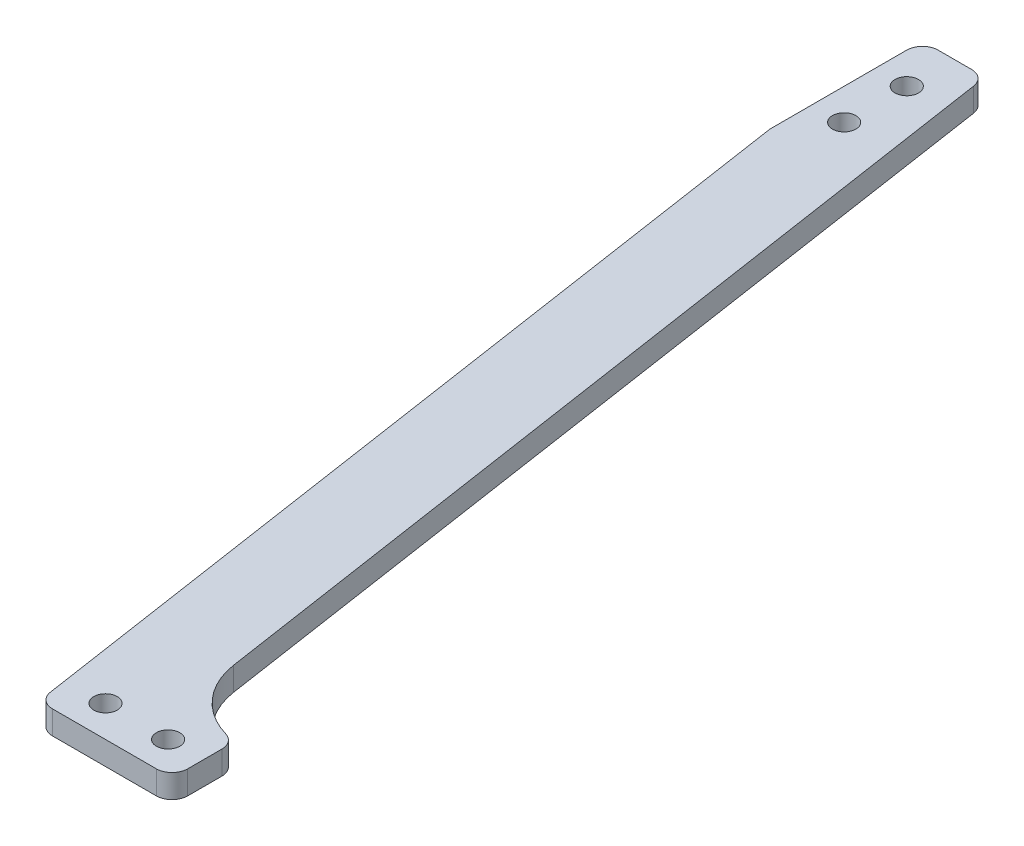
ISO-10303-21;
HEADER;
FILE_DESCRIPTION(('STEP AP214'),'2;1');
FILE_NAME('part.step','',(''),(''),'','','');
FILE_SCHEMA(('AUTOMOTIVE_DESIGN { 1 0 10303 214 1 1 1 1 }'));
ENDSEC;
DATA;
#1=APPLICATION_CONTEXT('core data for automotive mechanical design processes');
#2=APPLICATION_PROTOCOL_DEFINITION('international standard','automotive_design',2000,#1);
#3=PRODUCT_CONTEXT('',#1,'mechanical');
#4=PRODUCT('Part','Part','',(#3));
#5=PRODUCT_RELATED_PRODUCT_CATEGORY('part','',(#4));
#6=PRODUCT_DEFINITION_FORMATION('','',#4);
#7=PRODUCT_DEFINITION_CONTEXT('part definition',#1,'design');
#8=PRODUCT_DEFINITION('design','',#6,#7);
#9=PRODUCT_DEFINITION_SHAPE('','',#8);
#10=(LENGTH_UNIT() NAMED_UNIT(*) SI_UNIT(.MILLI.,.METRE.));
#11=(NAMED_UNIT(*) PLANE_ANGLE_UNIT() SI_UNIT($,.RADIAN.));
#12=(NAMED_UNIT(*) SI_UNIT($,.STERADIAN.) SOLID_ANGLE_UNIT());
#13=UNCERTAINTY_MEASURE_WITH_UNIT(LENGTH_MEASURE(1.E-05),#10,'distance_accuracy_value','');
#14=(GEOMETRIC_REPRESENTATION_CONTEXT(3) GLOBAL_UNCERTAINTY_ASSIGNED_CONTEXT((#13)) GLOBAL_UNIT_ASSIGNED_CONTEXT((#10,
#11,#12)) REPRESENTATION_CONTEXT('',''));
#15=CARTESIAN_POINT('',(0.,0.,0.));
#16=DIRECTION('',(0.,0.,1.));
#17=DIRECTION('',(1.,0.,0.));
#18=AXIS2_PLACEMENT_3D('',#15,#16,#17);
#19=CARTESIAN_POINT('',(0.,3.,0.));
#20=DIRECTION('',(0.,-1.,0.));
#21=DIRECTION('',(0.,0.,-1.));
#22=AXIS2_PLACEMENT_3D('',#19,#20,#21);
#23=PLANE('',#22);
#24=DIRECTION('',(0.,0.,-1.));
#25=VECTOR('',#24,1.);
#26=CARTESIAN_POINT('',(33.6,3.,-8.));
#27=LINE('',#26,#25);
#28=CARTESIAN_POINT('',(33.6,3.,-2.));
#29=VERTEX_POINT('',#28);
#30=CARTESIAN_POINT('',(33.6,3.,-6.38608106159937));
#31=VERTEX_POINT('',#30);
#32=EDGE_CURVE('E160',#29,#31,#27,.T.);
#33=ORIENTED_EDGE('',*,*,#32,.T.);
#34=CARTESIAN_POINT('',(31.6,3.,-6.38608106159937));
#35=DIRECTION('',(0.,-1.,0.));
#36=DIRECTION('',(0.,0.,-1.));
#37=AXIS2_PLACEMENT_3D('',#34,#35,#36);
#38=CIRCLE('',#37,2.);
#39=CARTESIAN_POINT('',(32.1589127990271,3.,-8.30639782793864));
#40=VERTEX_POINT('',#39);
#41=EDGE_CURVE('E11',#31,#40,#38,.F.);
#42=ORIENTED_EDGE('',*,*,#41,.T.);
#43=CARTESIAN_POINT('',(34.9534767941624,3.,-17.907981659635));
#44=DIRECTION('',(0.,-1.,0.));
#45=DIRECTION('',(0.,0.,-1.));
#46=AXIS2_PLACEMENT_3D('',#43,#44,#45);
#47=CIRCLE('',#46,10.);
#48=CARTESIAN_POINT('',(25.0654358715812,3.,-16.4157863931364));
#49=VERTEX_POINT('',#48);
#50=EDGE_CURVE('E190',#40,#49,#47,.T.);
#51=ORIENTED_EDGE('',*,*,#50,.T.);
#52=DIRECTION('',(-0.149219526649861,0.,-0.988804092258113));
#53=VECTOR('',#52,1.);
#54=CARTESIAN_POINT('',(8.,3.,-129.5));
#55=LINE('',#54,#53);
#56=CARTESIAN_POINT('',(8.25678101559295,3.,-127.7984390533));
#57=VERTEX_POINT('',#56);
#58=EDGE_CURVE('E169',#49,#57,#55,.T.);
#59=ORIENTED_EDGE('',*,*,#58,.T.);
#60=CARTESIAN_POINT('',(6.27917283107673,3.,-127.5));
#61=DIRECTION('',(0.,-1.,0.));
#62=DIRECTION('',(0.,0.,-1.));
#63=AXIS2_PLACEMENT_3D('',#60,#61,#62);
#64=CIRCLE('',#63,2.);
#65=CARTESIAN_POINT('',(6.27917283107673,3.,-129.5));
#66=VERTEX_POINT('',#65);
#67=EDGE_CURVE('E212',#57,#66,#64,.F.);
#68=ORIENTED_EDGE('',*,*,#67,.T.);
#69=DIRECTION('',(-1.,0.,0.));
#70=VECTOR('',#69,1.);
#71=CARTESIAN_POINT('',(0.,3.,-129.5));
#72=LINE('',#71,#70);
#73=CARTESIAN_POINT('',(2.,3.,-129.5));
#74=VERTEX_POINT('',#73);
#75=EDGE_CURVE('E143',#66,#74,#72,.T.);
#76=ORIENTED_EDGE('',*,*,#75,.T.);
#77=CARTESIAN_POINT('',(2.,3.,-127.5));
#78=DIRECTION('',(0.,-1.,0.));
#79=DIRECTION('',(0.,0.,-1.));
#80=AXIS2_PLACEMENT_3D('',#77,#78,#79);
#81=CIRCLE('',#80,2.);
#82=CARTESIAN_POINT('',(0.,3.,-127.5));
#83=VERTEX_POINT('',#82);
#84=EDGE_CURVE('E138',#74,#83,#81,.F.);
#85=ORIENTED_EDGE('',*,*,#84,.T.);
#86=DIRECTION('',(0.,0.,1.));
#87=VECTOR('',#86,1.);
#88=CARTESIAN_POINT('',(0.,3.,-110.));
#89=LINE('',#88,#87);
#90=CARTESIAN_POINT('',(0.,3.,-110.));
#91=VERTEX_POINT('',#90);
#92=EDGE_CURVE('E130',#83,#91,#89,.T.);
#93=ORIENTED_EDGE('',*,*,#92,.T.);
#94=DIRECTION('',(0.149219526649861,0.,0.988804092258113));
#95=VECTOR('',#94,1.);
#96=CARTESIAN_POINT('',(16.6,3.,0.));
#97=LINE('',#96,#95);
#98=CARTESIAN_POINT('',(16.343218984407,3.,-1.70156094670028));
#99=VERTEX_POINT('',#98);
#100=EDGE_CURVE('E134',#91,#99,#97,.T.);
#101=ORIENTED_EDGE('',*,*,#100,.T.);
#102=CARTESIAN_POINT('',(18.3208271689233,3.,-2.));
#103=DIRECTION('',(0.,-1.,0.));
#104=DIRECTION('',(0.,0.,-1.));
#105=AXIS2_PLACEMENT_3D('',#102,#103,#104);
#106=CIRCLE('',#105,2.);
#107=CARTESIAN_POINT('',(18.3208271689233,3.,0.));
#108=VERTEX_POINT('',#107);
#109=EDGE_CURVE('E209',#99,#108,#106,.F.);
#110=ORIENTED_EDGE('',*,*,#109,.T.);
#111=DIRECTION('',(1.,0.,0.));
#112=VECTOR('',#111,1.);
#113=CARTESIAN_POINT('',(33.6,3.,0.));
#114=LINE('',#113,#112);
#115=CARTESIAN_POINT('',(31.6,3.,0.));
#116=VERTEX_POINT('',#115);
#117=EDGE_CURVE('E157',#108,#116,#114,.T.);
#118=ORIENTED_EDGE('',*,*,#117,.T.);
#119=CARTESIAN_POINT('',(31.6,3.,-2.));
#120=DIRECTION('',(0.,-1.,0.));
#121=DIRECTION('',(0.,0.,-1.));
#122=AXIS2_PLACEMENT_3D('',#119,#120,#121);
#123=CIRCLE('',#122,2.);
#124=EDGE_CURVE('E207',#116,#29,#123,.F.);
#125=ORIENTED_EDGE('',*,*,#124,.T.);
#126=EDGE_LOOP('',(#33,#42,#51,#59,#68,#76,#85,#93,#101,#110,#118,#125));
#127=FACE_BOUND('',#126,.T.);
#128=CARTESIAN_POINT('',(29.1,3.,-4.00000000000001));
#129=DIRECTION('',(0.,1.,0.));
#130=DIRECTION('',(0.,0.,1.));
#131=AXIS2_PLACEMENT_3D('',#128,#129,#130);
#132=CIRCLE('',#131,1.5);
#133=CARTESIAN_POINT('',(29.1,3.,-2.50000000000001));
#134=VERTEX_POINT('',#133);
#135=EDGE_CURVE('E176',#134,#134,#132,.T.);
#136=ORIENTED_EDGE('',*,*,#135,.F.);
#137=EDGE_LOOP('',(#136));
#138=FACE_BOUND('',#137,.T.);
#139=CARTESIAN_POINT('',(21.1,3.,-4.));
#140=DIRECTION('',(0.,1.,0.));
#141=DIRECTION('',(0.,0.,1.));
#142=AXIS2_PLACEMENT_3D('',#139,#140,#141);
#143=CIRCLE('',#142,1.5);
#144=CARTESIAN_POINT('',(21.1,3.,-2.5));
#145=VERTEX_POINT('',#144);
#146=EDGE_CURVE('E423',#145,#145,#143,.T.);
#147=ORIENTED_EDGE('',*,*,#146,.F.);
#148=EDGE_LOOP('',(#147));
#149=FACE_BOUND('',#148,.T.);
#150=CARTESIAN_POINT('',(4.,3.,-115.5));
#151=DIRECTION('',(0.,1.,0.));
#152=DIRECTION('',(0.,0.,1.));
#153=AXIS2_PLACEMENT_3D('',#150,#151,#152);
#154=CIRCLE('',#153,1.5);
#155=CARTESIAN_POINT('',(4.,3.,-114.));
#156=VERTEX_POINT('',#155);
#157=EDGE_CURVE('E429',#156,#156,#154,.T.);
#158=ORIENTED_EDGE('',*,*,#157,.F.);
#159=EDGE_LOOP('',(#158));
#160=FACE_BOUND('',#159,.T.);
#161=CARTESIAN_POINT('',(4.,3.,-123.5));
#162=DIRECTION('',(0.,1.,0.));
#163=DIRECTION('',(0.,0.,1.));
#164=AXIS2_PLACEMENT_3D('',#161,#162,#163);
#165=CIRCLE('',#164,1.5);
#166=CARTESIAN_POINT('',(4.,3.,-122.));
#167=VERTEX_POINT('',#166);
#168=EDGE_CURVE('E435',#167,#167,#165,.T.);
#169=ORIENTED_EDGE('',*,*,#168,.F.);
#170=EDGE_LOOP('',(#169));
#171=FACE_BOUND('',#170,.T.);
#172=ADVANCED_FACE('F41',(#127,#138,#149,#160,#171),#23,.F.);
#173=CARTESIAN_POINT('',(0.,0.,0.));
#174=DIRECTION('',(0.,-1.,0.));
#175=DIRECTION('',(0.,0.,-1.));
#176=AXIS2_PLACEMENT_3D('',#173,#174,#175);
#177=PLANE('',#176);
#178=CARTESIAN_POINT('',(4.,0.,-115.5));
#179=DIRECTION('',(0.,1.,0.));
#180=DIRECTION('',(0.,0.,1.));
#181=AXIS2_PLACEMENT_3D('',#178,#179,#180);
#182=CIRCLE('',#181,1.5);
#183=CARTESIAN_POINT('',(4.,0.,-114.));
#184=VERTEX_POINT('',#183);
#185=EDGE_CURVE('E432',#184,#184,#182,.T.);
#186=ORIENTED_EDGE('',*,*,#185,.T.);
#187=EDGE_LOOP('',(#186));
#188=FACE_BOUND('',#187,.T.);
#189=CARTESIAN_POINT('',(29.1,0.,-4.00000000000001));
#190=DIRECTION('',(0.,1.,0.));
#191=DIRECTION('',(0.,0.,1.));
#192=AXIS2_PLACEMENT_3D('',#189,#190,#191);
#193=CIRCLE('',#192,1.5);
#194=CARTESIAN_POINT('',(29.1,0.,-2.50000000000001));
#195=VERTEX_POINT('',#194);
#196=EDGE_CURVE('E165',#195,#195,#193,.T.);
#197=ORIENTED_EDGE('',*,*,#196,.T.);
#198=EDGE_LOOP('',(#197));
#199=FACE_BOUND('',#198,.T.);
#200=CARTESIAN_POINT('',(34.9534767941624,0.,-17.907981659635));
#201=DIRECTION('',(0.,-1.,0.));
#202=DIRECTION('',(0.,0.,-1.));
#203=AXIS2_PLACEMENT_3D('',#200,#201,#202);
#204=CIRCLE('',#203,10.);
#205=CARTESIAN_POINT('',(25.0654358715812,0.,-16.4157863931364));
#206=VERTEX_POINT('',#205);
#207=CARTESIAN_POINT('',(32.1589127990271,0.,-8.30639782793864));
#208=VERTEX_POINT('',#207);
#209=EDGE_CURVE('E188',#206,#208,#204,.F.);
#210=ORIENTED_EDGE('',*,*,#209,.T.);
#211=CARTESIAN_POINT('',(31.6,0.,-6.38608106159937));
#212=DIRECTION('',(0.,-1.,0.));
#213=DIRECTION('',(0.,0.,-1.));
#214=AXIS2_PLACEMENT_3D('',#211,#212,#213);
#215=CIRCLE('',#214,2.);
#216=CARTESIAN_POINT('',(33.6,0.,-6.38608106159937));
#217=VERTEX_POINT('',#216);
#218=EDGE_CURVE('E63',#208,#217,#215,.T.);
#219=ORIENTED_EDGE('',*,*,#218,.T.);
#220=DIRECTION('',(0.,0.,-1.));
#221=VECTOR('',#220,1.);
#222=CARTESIAN_POINT('',(33.6,0.,-8.));
#223=LINE('',#222,#221);
#224=CARTESIAN_POINT('',(33.6,0.,-2.));
#225=VERTEX_POINT('',#224);
#226=EDGE_CURVE('E179',#225,#217,#223,.T.);
#227=ORIENTED_EDGE('',*,*,#226,.F.);
#228=CARTESIAN_POINT('',(31.6,0.,-2.));
#229=DIRECTION('',(0.,-1.,0.));
#230=DIRECTION('',(0.,0.,-1.));
#231=AXIS2_PLACEMENT_3D('',#228,#229,#230);
#232=CIRCLE('',#231,2.);
#233=CARTESIAN_POINT('',(31.6,0.,0.));
#234=VERTEX_POINT('',#233);
#235=EDGE_CURVE('E197',#225,#234,#232,.T.);
#236=ORIENTED_EDGE('',*,*,#235,.T.);
#237=DIRECTION('',(1.,0.,0.));
#238=VECTOR('',#237,1.);
#239=CARTESIAN_POINT('',(33.6,0.,0.));
#240=LINE('',#239,#238);
#241=CARTESIAN_POINT('',(18.3208271689233,0.,0.));
#242=VERTEX_POINT('',#241);
#243=EDGE_CURVE('E175',#242,#234,#240,.T.);
#244=ORIENTED_EDGE('',*,*,#243,.F.);
#245=CARTESIAN_POINT('',(18.3208271689233,0.,-2.));
#246=DIRECTION('',(0.,-1.,0.));
#247=DIRECTION('',(0.,0.,-1.));
#248=AXIS2_PLACEMENT_3D('',#245,#246,#247);
#249=CIRCLE('',#248,2.);
#250=CARTESIAN_POINT('',(16.343218984407,0.,-1.70156094670028));
#251=VERTEX_POINT('',#250);
#252=EDGE_CURVE('E199',#242,#251,#249,.T.);
#253=ORIENTED_EDGE('',*,*,#252,.T.);
#254=DIRECTION('',(0.149219526649861,0.,0.988804092258113));
#255=VECTOR('',#254,1.);
#256=CARTESIAN_POINT('',(16.6,0.,0.));
#257=LINE('',#256,#255);
#258=CARTESIAN_POINT('',(0.,0.,-110.));
#259=VERTEX_POINT('',#258);
#260=EDGE_CURVE('E173',#259,#251,#257,.T.);
#261=ORIENTED_EDGE('',*,*,#260,.F.);
#262=DIRECTION('',(0.,0.,1.));
#263=VECTOR('',#262,1.);
#264=CARTESIAN_POINT('',(0.,0.,-110.));
#265=LINE('',#264,#263);
#266=CARTESIAN_POINT('',(0.,0.,-127.5));
#267=VERTEX_POINT('',#266);
#268=EDGE_CURVE('E148',#267,#259,#265,.T.);
#269=ORIENTED_EDGE('',*,*,#268,.F.);
#270=CARTESIAN_POINT('',(2.,0.,-127.5));
#271=DIRECTION('',(0.,-1.,0.));
#272=DIRECTION('',(0.,0.,-1.));
#273=AXIS2_PLACEMENT_3D('',#270,#271,#272);
#274=CIRCLE('',#273,2.);
#275=CARTESIAN_POINT('',(2.,0.,-129.5));
#276=VERTEX_POINT('',#275);
#277=EDGE_CURVE('E201',#267,#276,#274,.T.);
#278=ORIENTED_EDGE('',*,*,#277,.T.);
#279=DIRECTION('',(-1.,0.,0.));
#280=VECTOR('',#279,1.);
#281=CARTESIAN_POINT('',(0.,0.,-129.5));
#282=LINE('',#281,#280);
#283=CARTESIAN_POINT('',(6.27917283107673,0.,-129.5));
#284=VERTEX_POINT('',#283);
#285=EDGE_CURVE('E162',#284,#276,#282,.T.);
#286=ORIENTED_EDGE('',*,*,#285,.F.);
#287=CARTESIAN_POINT('',(6.27917283107673,0.,-127.5));
#288=DIRECTION('',(0.,-1.,0.));
#289=DIRECTION('',(0.,0.,-1.));
#290=AXIS2_PLACEMENT_3D('',#287,#288,#289);
#291=CIRCLE('',#290,2.);
#292=CARTESIAN_POINT('',(8.25678101559295,0.,-127.7984390533));
#293=VERTEX_POINT('',#292);
#294=EDGE_CURVE('E203',#284,#293,#291,.T.);
#295=ORIENTED_EDGE('',*,*,#294,.T.);
#296=DIRECTION('',(-0.149219526649861,0.,-0.988804092258113));
#297=VECTOR('',#296,1.);
#298=CARTESIAN_POINT('',(8.,0.,-129.5));
#299=LINE('',#298,#297);
#300=EDGE_CURVE('E181',#206,#293,#299,.T.);
#301=ORIENTED_EDGE('',*,*,#300,.F.);
#302=EDGE_LOOP('',(#210,#219,#227,#236,#244,#253,#261,#269,#278,#286,#295,#301));
#303=FACE_BOUND('',#302,.T.);
#304=CARTESIAN_POINT('',(21.1,0.,-4.));
#305=DIRECTION('',(0.,1.,0.));
#306=DIRECTION('',(0.,0.,1.));
#307=AXIS2_PLACEMENT_3D('',#304,#305,#306);
#308=CIRCLE('',#307,1.5);
#309=CARTESIAN_POINT('',(21.1,0.,-2.5));
#310=VERTEX_POINT('',#309);
#311=EDGE_CURVE('E425',#310,#310,#308,.T.);
#312=ORIENTED_EDGE('',*,*,#311,.T.);
#313=EDGE_LOOP('',(#312));
#314=FACE_BOUND('',#313,.T.);
#315=CARTESIAN_POINT('',(4.,0.,-123.5));
#316=DIRECTION('',(0.,1.,0.));
#317=DIRECTION('',(0.,0.,1.));
#318=AXIS2_PLACEMENT_3D('',#315,#316,#317);
#319=CIRCLE('',#318,1.5);
#320=CARTESIAN_POINT('',(4.,0.,-122.));
#321=VERTEX_POINT('',#320);
#322=EDGE_CURVE('E438',#321,#321,#319,.T.);
#323=ORIENTED_EDGE('',*,*,#322,.T.);
#324=EDGE_LOOP('',(#323));
#325=FACE_BOUND('',#324,.T.);
#326=ADVANCED_FACE('F236',(#188,#199,#303,#314,#325),#177,.T.);
#327=CARTESIAN_POINT('',(16.6,3.,0.));
#328=DIRECTION('',(0.988804092258113,0.,-0.149219526649861));
#329=DIRECTION('',(-0.149219526649861,0.,-0.988804092258113));
#330=AXIS2_PLACEMENT_3D('',#327,#328,#329);
#331=PLANE('',#330);
#332=ORIENTED_EDGE('',*,*,#260,.T.);
#333=DIRECTION('',(0.,-1.,0.));
#334=VECTOR('',#333,1.);
#335=CARTESIAN_POINT('',(16.343218984407,3.,-1.70156094670028));
#336=LINE('',#335,#334);
#337=EDGE_CURVE('E156',#251,#99,#336,.F.);
#338=ORIENTED_EDGE('',*,*,#337,.T.);
#339=ORIENTED_EDGE('',*,*,#100,.F.);
#340=DIRECTION('',(0.,-1.,0.));
#341=VECTOR('',#340,1.);
#342=CARTESIAN_POINT('',(0.,3.,-110.));
#343=LINE('',#342,#341);
#344=EDGE_CURVE('E142',#91,#259,#343,.T.);
#345=ORIENTED_EDGE('',*,*,#344,.T.);
#346=EDGE_LOOP('',(#332,#338,#339,#345));
#347=FACE_BOUND('',#346,.T.);
#348=ADVANCED_FACE('F154',(#347),#331,.F.);
#349=CARTESIAN_POINT('',(33.6,3.,0.));
#350=DIRECTION('',(0.,0.,-1.));
#351=DIRECTION('',(-1.,0.,0.));
#352=AXIS2_PLACEMENT_3D('',#349,#350,#351);
#353=PLANE('',#352);
#354=ORIENTED_EDGE('',*,*,#117,.F.);
#355=DIRECTION('',(0.,-1.,0.));
#356=VECTOR('',#355,1.);
#357=CARTESIAN_POINT('',(18.3208271689233,3.,0.));
#358=LINE('',#357,#356);
#359=EDGE_CURVE('E218',#108,#242,#358,.T.);
#360=ORIENTED_EDGE('',*,*,#359,.T.);
#361=ORIENTED_EDGE('',*,*,#243,.T.);
#362=DIRECTION('',(0.,-1.,0.));
#363=VECTOR('',#362,1.);
#364=CARTESIAN_POINT('',(31.6,3.,0.));
#365=LINE('',#364,#363);
#366=EDGE_CURVE('E216',#234,#116,#365,.F.);
#367=ORIENTED_EDGE('',*,*,#366,.T.);
#368=EDGE_LOOP('',(#354,#360,#361,#367));
#369=FACE_BOUND('',#368,.T.);
#370=ADVANCED_FACE('F260',(#369),#353,.F.);
#371=CARTESIAN_POINT('',(33.6,3.,-8.));
#372=DIRECTION('',(-1.,0.,0.));
#373=DIRECTION('',(0.,0.,1.));
#374=AXIS2_PLACEMENT_3D('',#371,#372,#373);
#375=PLANE('',#374);
#376=ORIENTED_EDGE('',*,*,#226,.T.);
#377=DIRECTION('',(0.,-1.,0.));
#378=VECTOR('',#377,1.);
#379=CARTESIAN_POINT('',(33.6,3.,-6.38608106159937));
#380=LINE('',#379,#378);
#381=EDGE_CURVE('E49',#217,#31,#380,.F.);
#382=ORIENTED_EDGE('',*,*,#381,.T.);
#383=ORIENTED_EDGE('',*,*,#32,.F.);
#384=DIRECTION('',(0.,-1.,0.));
#385=VECTOR('',#384,1.);
#386=CARTESIAN_POINT('',(33.6,3.,-2.));
#387=LINE('',#386,#385);
#388=EDGE_CURVE('E222',#29,#225,#387,.T.);
#389=ORIENTED_EDGE('',*,*,#388,.T.);
#390=EDGE_LOOP('',(#376,#382,#383,#389));
#391=FACE_BOUND('',#390,.T.);
#392=ADVANCED_FACE('F265',(#391),#375,.F.);
#393=CARTESIAN_POINT('',(8.,3.,-129.5));
#394=DIRECTION('',(-0.988804092258113,0.,0.149219526649861));
#395=DIRECTION('',(0.149219526649861,0.,0.988804092258113));
#396=AXIS2_PLACEMENT_3D('',#393,#394,#395);
#397=PLANE('',#396);
#398=ORIENTED_EDGE('',*,*,#300,.T.);
#399=DIRECTION('',(0.,-1.,0.));
#400=VECTOR('',#399,1.);
#401=CARTESIAN_POINT('',(8.25678101559295,3.,-127.7984390533));
#402=LINE('',#401,#400);
#403=EDGE_CURVE('E205',#293,#57,#402,.F.);
#404=ORIENTED_EDGE('',*,*,#403,.T.);
#405=ORIENTED_EDGE('',*,*,#58,.F.);
#406=DIRECTION('',(0.,-1.,0.));
#407=VECTOR('',#406,1.);
#408=CARTESIAN_POINT('',(25.0654358715812,3.,-16.4157863931364));
#409=LINE('',#408,#407);
#410=EDGE_CURVE('E152',#49,#206,#409,.T.);
#411=ORIENTED_EDGE('',*,*,#410,.T.);
#412=EDGE_LOOP('',(#398,#404,#405,#411));
#413=FACE_BOUND('',#412,.T.);
#414=ADVANCED_FACE('F241',(#413),#397,.F.);
#415=CARTESIAN_POINT('',(0.,3.,-129.5));
#416=DIRECTION('',(0.,0.,1.));
#417=DIRECTION('',(1.,0.,0.));
#418=AXIS2_PLACEMENT_3D('',#415,#416,#417);
#419=PLANE('',#418);
#420=ORIENTED_EDGE('',*,*,#75,.F.);
#421=DIRECTION('',(0.,-1.,0.));
#422=VECTOR('',#421,1.);
#423=CARTESIAN_POINT('',(6.27917283107673,3.,-129.5));
#424=LINE('',#423,#422);
#425=EDGE_CURVE('E194',#66,#284,#424,.T.);
#426=ORIENTED_EDGE('',*,*,#425,.T.);
#427=ORIENTED_EDGE('',*,*,#285,.T.);
#428=DIRECTION('',(0.,-1.,0.));
#429=VECTOR('',#428,1.);
#430=CARTESIAN_POINT('',(2.,3.,-129.5));
#431=LINE('',#430,#429);
#432=EDGE_CURVE('E192',#276,#74,#431,.F.);
#433=ORIENTED_EDGE('',*,*,#432,.T.);
#434=EDGE_LOOP('',(#420,#426,#427,#433));
#435=FACE_BOUND('',#434,.T.);
#436=ADVANCED_FACE('F249',(#435),#419,.F.);
#437=CARTESIAN_POINT('',(0.,3.,-110.));
#438=DIRECTION('',(1.,0.,0.));
#439=DIRECTION('',(0.,0.,-1.));
#440=AXIS2_PLACEMENT_3D('',#437,#438,#439);
#441=PLANE('',#440);
#442=ORIENTED_EDGE('',*,*,#92,.F.);
#443=DIRECTION('',(0.,-1.,0.));
#444=VECTOR('',#443,1.);
#445=CARTESIAN_POINT('',(0.,3.,-127.5));
#446=LINE('',#445,#444);
#447=EDGE_CURVE('E214',#83,#267,#446,.T.);
#448=ORIENTED_EDGE('',*,*,#447,.T.);
#449=ORIENTED_EDGE('',*,*,#268,.T.);
#450=ORIENTED_EDGE('',*,*,#344,.F.);
#451=EDGE_LOOP('',(#442,#448,#449,#450));
#452=FACE_BOUND('',#451,.T.);
#453=ADVANCED_FACE('F146',(#452),#441,.F.);
#454=CARTESIAN_POINT('',(29.1,3.,-4.00000000000001));
#455=DIRECTION('',(0.,-1.,0.));
#456=DIRECTION('',(0.,0.,-1.));
#457=AXIS2_PLACEMENT_3D('',#454,#455,#456);
#458=CYLINDRICAL_SURFACE('',#457,1.5);
#459=ORIENTED_EDGE('',*,*,#135,.T.);
#460=EDGE_LOOP('',(#459));
#461=FACE_BOUND('',#460,.T.);
#462=ORIENTED_EDGE('',*,*,#196,.F.);
#463=EDGE_LOOP('',(#462));
#464=FACE_BOUND('',#463,.T.);
#465=ADVANCED_FACE('F279',(#461,#464),#458,.F.);
#466=CARTESIAN_POINT('',(21.1,3.,-4.));
#467=DIRECTION('',(0.,-1.,0.));
#468=DIRECTION('',(0.,0.,-1.));
#469=AXIS2_PLACEMENT_3D('',#466,#467,#468);
#470=CYLINDRICAL_SURFACE('',#469,1.5);
#471=ORIENTED_EDGE('',*,*,#146,.T.);
#472=EDGE_LOOP('',(#471));
#473=FACE_BOUND('',#472,.T.);
#474=ORIENTED_EDGE('',*,*,#311,.F.);
#475=EDGE_LOOP('',(#474));
#476=FACE_BOUND('',#475,.T.);
#477=ADVANCED_FACE('F347',(#473,#476),#470,.F.);
#478=CARTESIAN_POINT('',(4.,3.,-115.5));
#479=DIRECTION('',(0.,-1.,0.));
#480=DIRECTION('',(0.,0.,-1.));
#481=AXIS2_PLACEMENT_3D('',#478,#479,#480);
#482=CYLINDRICAL_SURFACE('',#481,1.5);
#483=ORIENTED_EDGE('',*,*,#157,.T.);
#484=EDGE_LOOP('',(#483));
#485=FACE_BOUND('',#484,.T.);
#486=ORIENTED_EDGE('',*,*,#185,.F.);
#487=EDGE_LOOP('',(#486));
#488=FACE_BOUND('',#487,.T.);
#489=ADVANCED_FACE('F338',(#485,#488),#482,.F.);
#490=CARTESIAN_POINT('',(4.,3.,-123.5));
#491=DIRECTION('',(0.,-1.,0.));
#492=DIRECTION('',(0.,0.,-1.));
#493=AXIS2_PLACEMENT_3D('',#490,#491,#492);
#494=CYLINDRICAL_SURFACE('',#493,1.5);
#495=ORIENTED_EDGE('',*,*,#168,.T.);
#496=EDGE_LOOP('',(#495));
#497=FACE_BOUND('',#496,.T.);
#498=ORIENTED_EDGE('',*,*,#322,.F.);
#499=EDGE_LOOP('',(#498));
#500=FACE_BOUND('',#499,.T.);
#501=ADVANCED_FACE('F295',(#497,#500),#494,.F.);
#502=CARTESIAN_POINT('',(34.9534767941624,3.,-17.907981659635));
#503=DIRECTION('',(0.,-1.,0.));
#504=DIRECTION('',(0.,0.,-1.));
#505=AXIS2_PLACEMENT_3D('',#502,#503,#504);
#506=CYLINDRICAL_SURFACE('',#505,10.);
#507=ORIENTED_EDGE('',*,*,#50,.F.);
#508=DIRECTION('',(0.,-1.,0.));
#509=VECTOR('',#508,1.);
#510=CARTESIAN_POINT('',(32.1589127990271,3.,-8.30639782793864));
#511=LINE('',#510,#509);
#512=EDGE_CURVE('E225',#40,#208,#511,.T.);
#513=ORIENTED_EDGE('',*,*,#512,.T.);
#514=ORIENTED_EDGE('',*,*,#209,.F.);
#515=ORIENTED_EDGE('',*,*,#410,.F.);
#516=EDGE_LOOP('',(#507,#513,#514,#515));
#517=FACE_BOUND('',#516,.T.);
#518=ADVANCED_FACE('F231',(#517),#506,.F.);
#519=CARTESIAN_POINT('',(6.27917283107673,3.,-127.5));
#520=DIRECTION('',(0.,-1.,0.));
#521=DIRECTION('',(0.,0.,-1.));
#522=AXIS2_PLACEMENT_3D('',#519,#520,#521);
#523=CYLINDRICAL_SURFACE('',#522,2.);
#524=ORIENTED_EDGE('',*,*,#67,.F.);
#525=ORIENTED_EDGE('',*,*,#403,.F.);
#526=ORIENTED_EDGE('',*,*,#294,.F.);
#527=ORIENTED_EDGE('',*,*,#425,.F.);
#528=EDGE_LOOP('',(#524,#525,#526,#527));
#529=FACE_BOUND('',#528,.T.);
#530=ADVANCED_FACE('F245',(#529),#523,.T.);
#531=CARTESIAN_POINT('',(2.,3.,-127.5));
#532=DIRECTION('',(0.,-1.,0.));
#533=DIRECTION('',(0.,0.,-1.));
#534=AXIS2_PLACEMENT_3D('',#531,#532,#533);
#535=CYLINDRICAL_SURFACE('',#534,2.);
#536=ORIENTED_EDGE('',*,*,#84,.F.);
#537=ORIENTED_EDGE('',*,*,#432,.F.);
#538=ORIENTED_EDGE('',*,*,#277,.F.);
#539=ORIENTED_EDGE('',*,*,#447,.F.);
#540=EDGE_LOOP('',(#536,#537,#538,#539));
#541=FACE_BOUND('',#540,.T.);
#542=ADVANCED_FACE('F252',(#541),#535,.T.);
#543=CARTESIAN_POINT('',(18.3208271689233,3.,-2.));
#544=DIRECTION('',(0.,-1.,0.));
#545=DIRECTION('',(0.,0.,-1.));
#546=AXIS2_PLACEMENT_3D('',#543,#544,#545);
#547=CYLINDRICAL_SURFACE('',#546,2.);
#548=ORIENTED_EDGE('',*,*,#109,.F.);
#549=ORIENTED_EDGE('',*,*,#337,.F.);
#550=ORIENTED_EDGE('',*,*,#252,.F.);
#551=ORIENTED_EDGE('',*,*,#359,.F.);
#552=EDGE_LOOP('',(#548,#549,#550,#551));
#553=FACE_BOUND('',#552,.T.);
#554=ADVANCED_FACE('F255',(#553),#547,.T.);
#555=CARTESIAN_POINT('',(31.6,3.,-2.));
#556=DIRECTION('',(0.,-1.,0.));
#557=DIRECTION('',(0.,0.,-1.));
#558=AXIS2_PLACEMENT_3D('',#555,#556,#557);
#559=CYLINDRICAL_SURFACE('',#558,2.);
#560=ORIENTED_EDGE('',*,*,#124,.F.);
#561=ORIENTED_EDGE('',*,*,#366,.F.);
#562=ORIENTED_EDGE('',*,*,#235,.F.);
#563=ORIENTED_EDGE('',*,*,#388,.F.);
#564=EDGE_LOOP('',(#560,#561,#562,#563));
#565=FACE_BOUND('',#564,.T.);
#566=ADVANCED_FACE('F263',(#565),#559,.T.);
#567=CARTESIAN_POINT('',(31.6,3.,-6.38608106159937));
#568=DIRECTION('',(0.,-1.,0.));
#569=DIRECTION('',(0.,0.,-1.));
#570=AXIS2_PLACEMENT_3D('',#567,#568,#569);
#571=CYLINDRICAL_SURFACE('',#570,2.);
#572=ORIENTED_EDGE('',*,*,#41,.F.);
#573=ORIENTED_EDGE('',*,*,#381,.F.);
#574=ORIENTED_EDGE('',*,*,#218,.F.);
#575=ORIENTED_EDGE('',*,*,#512,.F.);
#576=EDGE_LOOP('',(#572,#573,#574,#575));
#577=FACE_BOUND('',#576,.T.);
#578=ADVANCED_FACE('F43',(#577),#571,.T.);
#579=CLOSED_SHELL('',(#172,#326,#348,#370,#392,#414,#436,#453,#465,#477,#489,#501,#518,#530,
#542,#554,#566,#578));
#580=MANIFOLD_SOLID_BREP('B2',#579);
#581=ADVANCED_BREP_SHAPE_REPRESENTATION('',(#18,#580),#14);
#582=SHAPE_DEFINITION_REPRESENTATION(#9,#581);
ENDSEC;
END-ISO-10303-21;
